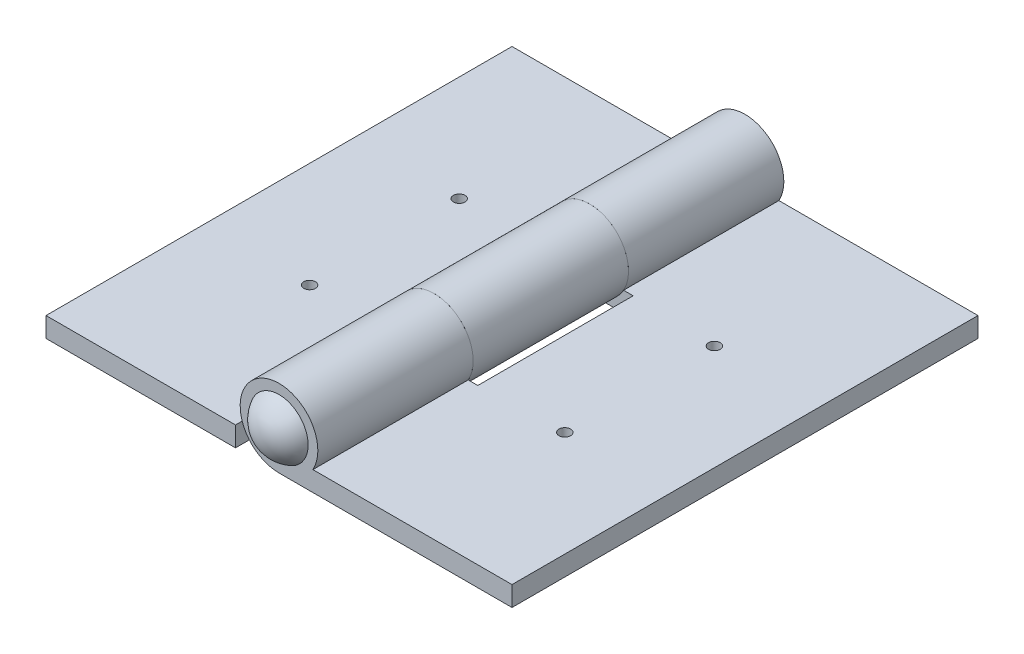
ISO-10303-21;
HEADER;
FILE_DESCRIPTION(('STEP AP214'),'2;1');
FILE_NAME('part.step','',(''),(''),'','','');
FILE_SCHEMA(('AUTOMOTIVE_DESIGN { 1 0 10303 214 1 1 1 1 }'));
ENDSEC;
DATA;
#1=APPLICATION_CONTEXT('core data for automotive mechanical design processes');
#2=APPLICATION_PROTOCOL_DEFINITION('international standard','automotive_design',2000,#1);
#3=PRODUCT_CONTEXT('',#1,'mechanical');
#4=PRODUCT('Part','Part','',(#3));
#5=PRODUCT_RELATED_PRODUCT_CATEGORY('part','',(#4));
#6=PRODUCT_DEFINITION_FORMATION('','',#4);
#7=PRODUCT_DEFINITION_CONTEXT('part definition',#1,'design');
#8=PRODUCT_DEFINITION('design','',#6,#7);
#9=PRODUCT_DEFINITION_SHAPE('','',#8);
#10=(LENGTH_UNIT() NAMED_UNIT(*) SI_UNIT(.MILLI.,.METRE.));
#11=(NAMED_UNIT(*) PLANE_ANGLE_UNIT() SI_UNIT($,.RADIAN.));
#12=(NAMED_UNIT(*) SI_UNIT($,.STERADIAN.) SOLID_ANGLE_UNIT());
#13=UNCERTAINTY_MEASURE_WITH_UNIT(LENGTH_MEASURE(1.E-05),#10,'distance_accuracy_value','');
#14=(GEOMETRIC_REPRESENTATION_CONTEXT(3) GLOBAL_UNCERTAINTY_ASSIGNED_CONTEXT((#13)) GLOBAL_UNIT_ASSIGNED_CONTEXT((#10,
#11,#12)) REPRESENTATION_CONTEXT('',''));
#15=CARTESIAN_POINT('',(0.,0.,0.));
#16=DIRECTION('',(0.,0.,1.));
#17=DIRECTION('',(1.,0.,0.));
#18=AXIS2_PLACEMENT_3D('',#15,#16,#17);
#19=CARTESIAN_POINT('',(0.,0.,-17.8436537890625));
#20=DIRECTION('',(0.,0.,-1.));
#21=DIRECTION('',(1.,0.,0.));
#22=AXIS2_PLACEMENT_3D('',#19,#20,#21);
#23=SPHERICAL_SURFACE('',#22,2.6693862109375);
#24=CARTESIAN_POINT('',(0.,0.,-19.05));
#25=DIRECTION('',(0.,0.,-1.));
#26=DIRECTION('',(-1.,0.,0.));
#27=AXIS2_PLACEMENT_3D('',#24,#25,#26);
#28=CIRCLE('',#27,2.38125);
#29=CARTESIAN_POINT('',(-2.38125,0.,-19.05));
#30=VERTEX_POINT('',#29);
#31=EDGE_CURVE('E59',#30,#30,#28,.T.);
#32=ORIENTED_EDGE('',*,*,#31,.T.);
#33=EDGE_LOOP('',(#32));
#34=FACE_BOUND('',#33,.T.);
#35=ADVANCED_FACE('F45',(#34),#23,.T.);
#36=CARTESIAN_POINT('',(0.,0.,17.8436537890625));
#37=DIRECTION('',(0.,0.,-1.));
#38=DIRECTION('',(-1.,0.,0.));
#39=AXIS2_PLACEMENT_3D('',#36,#37,#38);
#40=SPHERICAL_SURFACE('',#39,2.6693862109375);
#41=CARTESIAN_POINT('',(0.,0.,19.05));
#42=DIRECTION('',(0.,0.,-1.));
#43=DIRECTION('',(-1.,0.,0.));
#44=AXIS2_PLACEMENT_3D('',#41,#42,#43);
#45=CIRCLE('',#44,2.38125);
#46=CARTESIAN_POINT('',(-2.38125,0.,19.05));
#47=VERTEX_POINT('',#46);
#48=EDGE_CURVE('E11',#47,#47,#45,.T.);
#49=ORIENTED_EDGE('',*,*,#48,.F.);
#50=EDGE_LOOP('',(#49));
#51=FACE_BOUND('',#50,.T.);
#52=ADVANCED_FACE('F77',(#51),#40,.T.);
#53=CARTESIAN_POINT('',(-1.5875,0.,19.05));
#54=DIRECTION('',(0.,0.,-1.));
#55=DIRECTION('',(-1.,0.,0.));
#56=AXIS2_PLACEMENT_3D('',#53,#54,#55);
#57=PLANE('',#56);
#58=ORIENTED_EDGE('',*,*,#48,.T.);
#59=EDGE_LOOP('',(#58));
#60=FACE_BOUND('',#59,.T.);
#61=CARTESIAN_POINT('',(0.,0.,19.05));
#62=DIRECTION('',(0.,0.,-1.));
#63=DIRECTION('',(-1.,0.,0.));
#64=AXIS2_PLACEMENT_3D('',#61,#62,#63);
#65=CIRCLE('',#64,1.5875);
#66=CARTESIAN_POINT('',(-1.5875,0.,19.05));
#67=VERTEX_POINT('',#66);
#68=EDGE_CURVE('E51',#67,#67,#65,.T.);
#69=ORIENTED_EDGE('',*,*,#68,.F.);
#70=EDGE_LOOP('',(#69));
#71=FACE_BOUND('',#70,.T.);
#72=ADVANCED_FACE('F74',(#60,#71),#57,.T.);
#73=CARTESIAN_POINT('',(0.,0.,-20.51304));
#74=DIRECTION('',(0.,0.,-1.));
#75=DIRECTION('',(-1.,0.,0.));
#76=AXIS2_PLACEMENT_3D('',#73,#74,#75);
#77=CYLINDRICAL_SURFACE('',#76,1.5875);
#78=ORIENTED_EDGE('',*,*,#68,.T.);
#79=EDGE_LOOP('',(#78));
#80=FACE_BOUND('',#79,.T.);
#81=CARTESIAN_POINT('',(0.,0.,-19.05));
#82=DIRECTION('',(0.,0.,-1.));
#83=DIRECTION('',(-1.,0.,0.));
#84=AXIS2_PLACEMENT_3D('',#81,#82,#83);
#85=CIRCLE('',#84,1.5875);
#86=CARTESIAN_POINT('',(-1.5875,0.,-19.05));
#87=VERTEX_POINT('',#86);
#88=EDGE_CURVE('E55',#87,#87,#85,.T.);
#89=ORIENTED_EDGE('',*,*,#88,.F.);
#90=EDGE_LOOP('',(#89));
#91=FACE_BOUND('',#90,.T.);
#92=ADVANCED_FACE('F68',(#80,#91),#77,.T.);
#93=CARTESIAN_POINT('',(-2.38125,0.,-19.05));
#94=DIRECTION('',(0.,0.,1.));
#95=DIRECTION('',(1.,0.,0.));
#96=AXIS2_PLACEMENT_3D('',#93,#94,#95);
#97=PLANE('',#96);
#98=ORIENTED_EDGE('',*,*,#88,.T.);
#99=EDGE_LOOP('',(#98));
#100=FACE_BOUND('',#99,.T.);
#101=ORIENTED_EDGE('',*,*,#31,.F.);
#102=EDGE_LOOP('',(#101));
#103=FACE_BOUND('',#102,.T.);
#104=ADVANCED_FACE('F66',(#100,#103),#97,.T.);
#105=CLOSED_SHELL('',(#35,#52,#72,#92,#104));
#106=MANIFOLD_SOLID_BREP('B2',#105);
#107=CARTESIAN_POINT('',(-3.556,-1.54940000000001,19.05));
#108=DIRECTION('',(-1.,0.,0.));
#109=DIRECTION('',(0.,-1.,0.));
#110=AXIS2_PLACEMENT_3D('',#107,#108,#109);
#111=PLANE('',#110);
#112=DIRECTION('',(0.,-1.,0.));
#113=VECTOR('',#112,1.);
#114=CARTESIAN_POINT('',(-3.556,-1.54940000000001,6.35));
#115=LINE('',#114,#113);
#116=CARTESIAN_POINT('',(-3.556,-1.54940000000001,6.35));
#117=VERTEX_POINT('',#116);
#118=CARTESIAN_POINT('',(-3.556,-3.17500000000001,6.35));
#119=VERTEX_POINT('',#118);
#120=EDGE_CURVE('E220',#117,#119,#115,.T.);
#121=ORIENTED_EDGE('',*,*,#120,.F.);
#122=DIRECTION('',(0.,0.,-1.));
#123=VECTOR('',#122,1.);
#124=CARTESIAN_POINT('',(-3.556,-1.54940000000001,19.05));
#125=LINE('',#124,#123);
#126=CARTESIAN_POINT('',(-3.556,-1.54940000000001,19.05));
#127=VERTEX_POINT('',#126);
#128=EDGE_CURVE('E261',#127,#117,#125,.T.);
#129=ORIENTED_EDGE('',*,*,#128,.F.);
#130=DIRECTION('',(0.,1.,0.));
#131=VECTOR('',#130,1.);
#132=CARTESIAN_POINT('',(-3.556,-1.54940000000001,19.05));
#133=LINE('',#132,#131);
#134=CARTESIAN_POINT('',(-3.556,-3.17500000000001,19.05));
#135=VERTEX_POINT('',#134);
#136=EDGE_CURVE('E280',#135,#127,#133,.T.);
#137=ORIENTED_EDGE('',*,*,#136,.F.);
#138=DIRECTION('',(0.,0.,-1.));
#139=VECTOR('',#138,1.);
#140=CARTESIAN_POINT('',(-3.556,-3.17500000000001,19.05));
#141=LINE('',#140,#139);
#142=EDGE_CURVE('E133',#135,#119,#141,.T.);
#143=ORIENTED_EDGE('',*,*,#142,.T.);
#144=EDGE_LOOP('',(#121,#129,#137,#143));
#145=FACE_BOUND('',#144,.T.);
#146=ADVANCED_FACE('F124',(#145),#111,.F.);
#147=CARTESIAN_POINT('',(-19.05,-1.54940000000001,19.05));
#148=DIRECTION('',(1.,0.,0.));
#149=DIRECTION('',(0.,0.,-1.));
#150=AXIS2_PLACEMENT_3D('',#147,#148,#149);
#151=PLANE('',#150);
#152=DIRECTION('',(0.,-1.,0.));
#153=VECTOR('',#152,1.);
#154=CARTESIAN_POINT('',(-19.05,-1.54940000000001,-19.05));
#155=LINE('',#154,#153);
#156=CARTESIAN_POINT('',(-19.05,-1.54940000000001,-19.05));
#157=VERTEX_POINT('',#156);
#158=CARTESIAN_POINT('',(-19.05,-3.17500000000001,-19.05));
#159=VERTEX_POINT('',#158);
#160=EDGE_CURVE('E287',#157,#159,#155,.T.);
#161=ORIENTED_EDGE('',*,*,#160,.T.);
#162=DIRECTION('',(0.,0.,-1.));
#163=VECTOR('',#162,1.);
#164=CARTESIAN_POINT('',(-19.05,-3.17500000000001,19.05));
#165=LINE('',#164,#163);
#166=CARTESIAN_POINT('',(-19.05,-3.17500000000001,19.05));
#167=VERTEX_POINT('',#166);
#168=EDGE_CURVE('E43',#167,#159,#165,.T.);
#169=ORIENTED_EDGE('',*,*,#168,.F.);
#170=DIRECTION('',(0.,-1.,0.));
#171=VECTOR('',#170,1.);
#172=CARTESIAN_POINT('',(-19.05,-1.54940000000001,19.05));
#173=LINE('',#172,#171);
#174=CARTESIAN_POINT('',(-19.05,-1.54940000000001,19.05));
#175=VERTEX_POINT('',#174);
#176=EDGE_CURVE('E283',#175,#167,#173,.T.);
#177=ORIENTED_EDGE('',*,*,#176,.F.);
#178=DIRECTION('',(0.,0.,-1.));
#179=VECTOR('',#178,1.);
#180=CARTESIAN_POINT('',(-19.05,-1.54940000000001,19.05));
#181=LINE('',#180,#179);
#182=EDGE_CURVE('E262',#175,#157,#181,.T.);
#183=ORIENTED_EDGE('',*,*,#182,.T.);
#184=EDGE_LOOP('',(#161,#169,#177,#183));
#185=FACE_BOUND('',#184,.T.);
#186=ADVANCED_FACE('F126',(#185),#151,.F.);
#187=CARTESIAN_POINT('',(-19.05,-3.17500000000001,19.05));
#188=DIRECTION('',(0.,1.,0.));
#189=DIRECTION('',(0.,0.,1.));
#190=AXIS2_PLACEMENT_3D('',#187,#188,#189);
#191=PLANE('',#190);
#192=CARTESIAN_POINT('',(-10.43,-3.17500000000001,-6.115));
#193=DIRECTION('',(0.,-1.,0.));
#194=DIRECTION('',(0.,0.,-1.));
#195=AXIS2_PLACEMENT_3D('',#192,#193,#194);
#196=CIRCLE('',#195,0.474999999999988);
#197=CARTESIAN_POINT('',(-10.43,-3.17500000000001,-6.58999999999998));
#198=VERTEX_POINT('',#197);
#199=EDGE_CURVE('E327',#198,#198,#196,.T.);
#200=ORIENTED_EDGE('',*,*,#199,.F.);
#201=EDGE_LOOP('',(#200));
#202=FACE_BOUND('',#201,.T.);
#203=CARTESIAN_POINT('',(-10.43,-3.17500000000001,6.115));
#204=DIRECTION('',(0.,-1.,0.));
#205=DIRECTION('',(0.,0.,-1.));
#206=AXIS2_PLACEMENT_3D('',#203,#204,#205);
#207=CIRCLE('',#206,0.474999999999988);
#208=CARTESIAN_POINT('',(-10.43,-3.17500000000001,5.64000000000002));
#209=VERTEX_POINT('',#208);
#210=EDGE_CURVE('E330',#209,#209,#207,.T.);
#211=ORIENTED_EDGE('',*,*,#210,.F.);
#212=EDGE_LOOP('',(#211));
#213=FACE_BOUND('',#212,.T.);
#214=DIRECTION('',(1.,0.,0.));
#215=VECTOR('',#214,1.);
#216=CARTESIAN_POINT('',(-19.05,-3.17500000000001,-19.05));
#217=LINE('',#216,#215);
#218=CARTESIAN_POINT('',(-3.556,-3.17500000000001,-19.05));
#219=VERTEX_POINT('',#218);
#220=EDGE_CURVE('E290',#159,#219,#217,.T.);
#221=ORIENTED_EDGE('',*,*,#220,.T.);
#222=CARTESIAN_POINT('',(-3.556,-3.17500000000001,-6.34999999999998));
#223=VERTEX_POINT('',#222);
#224=EDGE_CURVE('E265',#223,#219,#141,.T.);
#225=ORIENTED_EDGE('',*,*,#224,.F.);
#226=DIRECTION('',(1.,0.,0.));
#227=VECTOR('',#226,1.);
#228=CARTESIAN_POINT('',(-3.556,-3.17500000000001,-6.35));
#229=LINE('',#228,#227);
#230=CARTESIAN_POINT('',(0.,-3.17500000000001,-6.35));
#231=VERTEX_POINT('',#230);
#232=EDGE_CURVE('E141',#223,#231,#229,.T.);
#233=ORIENTED_EDGE('',*,*,#232,.T.);
#234=DIRECTION('',(0.,0.,-1.));
#235=VECTOR('',#234,1.);
#236=CARTESIAN_POINT('',(0.,-3.17500000000001,15.603586385829));
#237=LINE('',#236,#235);
#238=CARTESIAN_POINT('',(0.,-3.17500000000001,6.35));
#239=VERTEX_POINT('',#238);
#240=EDGE_CURVE('E198',#239,#231,#237,.T.);
#241=ORIENTED_EDGE('',*,*,#240,.F.);
#242=DIRECTION('',(1.,0.,0.));
#243=VECTOR('',#242,1.);
#244=CARTESIAN_POINT('',(-3.556,-3.17500000000001,6.35));
#245=LINE('',#244,#243);
#246=EDGE_CURVE('E203',#119,#239,#245,.T.);
#247=ORIENTED_EDGE('',*,*,#246,.F.);
#248=ORIENTED_EDGE('',*,*,#142,.F.);
#249=DIRECTION('',(1.,0.,0.));
#250=VECTOR('',#249,1.);
#251=CARTESIAN_POINT('',(-19.05,-3.17500000000001,19.05));
#252=LINE('',#251,#250);
#253=EDGE_CURVE('E177',#167,#135,#252,.T.);
#254=ORIENTED_EDGE('',*,*,#253,.F.);
#255=ORIENTED_EDGE('',*,*,#168,.T.);
#256=EDGE_LOOP('',(#221,#225,#233,#241,#247,#248,#254,#255));
#257=FACE_BOUND('',#256,.T.);
#258=ADVANCED_FACE('F201',(#202,#213,#257),#191,.F.);
#259=CARTESIAN_POINT('',(-3.556,-1.54940000000001,-6.35));
#260=VERTEX_POINT('',#259);
#261=CARTESIAN_POINT('',(-3.556,-1.54940000000001,-19.05));
#262=VERTEX_POINT('',#261);
#263=EDGE_CURVE('E253',#260,#262,#125,.T.);
#264=ORIENTED_EDGE('',*,*,#263,.F.);
#265=DIRECTION('',(0.,-1.,0.));
#266=VECTOR('',#265,1.);
#267=CARTESIAN_POINT('',(-3.556,-1.54940000000001,-6.35));
#268=LINE('',#267,#266);
#269=EDGE_CURVE('E246',#260,#223,#268,.T.);
#270=ORIENTED_EDGE('',*,*,#269,.T.);
#271=ORIENTED_EDGE('',*,*,#224,.T.);
#272=DIRECTION('',(0.,1.,0.));
#273=VECTOR('',#272,1.);
#274=CARTESIAN_POINT('',(-3.556,-1.54940000000001,-19.05));
#275=LINE('',#274,#273);
#276=EDGE_CURVE('E260',#219,#262,#275,.T.);
#277=ORIENTED_EDGE('',*,*,#276,.T.);
#278=EDGE_LOOP('',(#264,#270,#271,#277));
#279=FACE_BOUND('',#278,.T.);
#280=ADVANCED_FACE('F258',(#279),#111,.F.);
#281=CARTESIAN_POINT('',(-19.05,-1.54940000000001,19.05));
#282=DIRECTION('',(0.,-1.,0.));
#283=DIRECTION('',(0.,0.,-1.));
#284=AXIS2_PLACEMENT_3D('',#281,#282,#283);
#285=PLANE('',#284);
#286=CARTESIAN_POINT('',(-10.43,-1.54940000000001,-6.115));
#287=DIRECTION('',(0.,-1.,0.));
#288=DIRECTION('',(0.,0.,-1.));
#289=AXIS2_PLACEMENT_3D('',#286,#287,#288);
#290=CIRCLE('',#289,0.474999999999994);
#291=CARTESIAN_POINT('',(-10.43,-1.54940000000001,-6.58999999999999));
#292=VERTEX_POINT('',#291);
#293=EDGE_CURVE('E332',#292,#292,#290,.T.);
#294=ORIENTED_EDGE('',*,*,#293,.T.);
#295=EDGE_LOOP('',(#294));
#296=FACE_BOUND('',#295,.T.);
#297=CARTESIAN_POINT('',(-10.43,-1.54940000000001,6.115));
#298=DIRECTION('',(0.,-1.,0.));
#299=DIRECTION('',(0.,0.,-1.));
#300=AXIS2_PLACEMENT_3D('',#297,#298,#299);
#301=CIRCLE('',#300,0.474999999999994);
#302=CARTESIAN_POINT('',(-10.43,-1.54940000000001,5.64000000000001));
#303=VERTEX_POINT('',#302);
#304=EDGE_CURVE('E225',#303,#303,#301,.T.);
#305=ORIENTED_EDGE('',*,*,#304,.T.);
#306=EDGE_LOOP('',(#305));
#307=FACE_BOUND('',#306,.T.);
#308=DIRECTION('',(-1.,0.,0.));
#309=VECTOR('',#308,1.);
#310=CARTESIAN_POINT('',(-19.05,-1.54940000000001,-19.05));
#311=LINE('',#310,#309);
#312=EDGE_CURVE('E170',#262,#157,#311,.T.);
#313=ORIENTED_EDGE('',*,*,#312,.T.);
#314=ORIENTED_EDGE('',*,*,#182,.F.);
#315=DIRECTION('',(-1.,0.,0.));
#316=VECTOR('',#315,1.);
#317=CARTESIAN_POINT('',(-19.05,-1.54940000000001,19.05));
#318=LINE('',#317,#316);
#319=EDGE_CURVE('E150',#127,#175,#318,.T.);
#320=ORIENTED_EDGE('',*,*,#319,.F.);
#321=ORIENTED_EDGE('',*,*,#128,.T.);
#322=DIRECTION('',(-1.,0.,0.));
#323=VECTOR('',#322,1.);
#324=CARTESIAN_POINT('',(-2.77127852082752,-1.5494,6.35));
#325=LINE('',#324,#323);
#326=CARTESIAN_POINT('',(-2.77127852082752,-1.5494,6.35));
#327=VERTEX_POINT('',#326);
#328=EDGE_CURVE('E216',#327,#117,#325,.T.);
#329=ORIENTED_EDGE('',*,*,#328,.F.);
#330=DIRECTION('',(0.,0.,-1.));
#331=VECTOR('',#330,1.);
#332=CARTESIAN_POINT('',(-2.77127852082752,-1.5494,15.603586385829));
#333=LINE('',#332,#331);
#334=CARTESIAN_POINT('',(-2.77127852082752,-1.5494,-6.35));
#335=VERTEX_POINT('',#334);
#336=EDGE_CURVE('E208',#327,#335,#333,.T.);
#337=ORIENTED_EDGE('',*,*,#336,.T.);
#338=DIRECTION('',(-1.,0.,0.));
#339=VECTOR('',#338,1.);
#340=CARTESIAN_POINT('',(-2.77127852082752,-1.5494,-6.35));
#341=LINE('',#340,#339);
#342=EDGE_CURVE('E242',#335,#260,#341,.T.);
#343=ORIENTED_EDGE('',*,*,#342,.T.);
#344=ORIENTED_EDGE('',*,*,#263,.T.);
#345=EDGE_LOOP('',(#313,#314,#320,#321,#329,#337,#343,#344));
#346=FACE_BOUND('',#345,.T.);
#347=ADVANCED_FACE('F251',(#296,#307,#346),#285,.F.);
#348=CARTESIAN_POINT('',(-19.05,-3.17500000000001,19.05));
#349=DIRECTION('',(0.,0.,1.));
#350=DIRECTION('',(1.,0.,0.));
#351=AXIS2_PLACEMENT_3D('',#348,#349,#350);
#352=PLANE('',#351);
#353=ORIENTED_EDGE('',*,*,#176,.T.);
#354=ORIENTED_EDGE('',*,*,#253,.T.);
#355=ORIENTED_EDGE('',*,*,#136,.T.);
#356=ORIENTED_EDGE('',*,*,#319,.T.);
#357=EDGE_LOOP('',(#353,#354,#355,#356));
#358=FACE_BOUND('',#357,.T.);
#359=ADVANCED_FACE('F294',(#358),#352,.T.);
#360=CARTESIAN_POINT('',(-19.05,-3.17500000000001,-19.05));
#361=DIRECTION('',(0.,0.,1.));
#362=DIRECTION('',(1.,0.,0.));
#363=AXIS2_PLACEMENT_3D('',#360,#361,#362);
#364=PLANE('',#363);
#365=ORIENTED_EDGE('',*,*,#160,.F.);
#366=ORIENTED_EDGE('',*,*,#312,.F.);
#367=ORIENTED_EDGE('',*,*,#276,.F.);
#368=ORIENTED_EDGE('',*,*,#220,.F.);
#369=EDGE_LOOP('',(#365,#366,#367,#368));
#370=FACE_BOUND('',#369,.T.);
#371=ADVANCED_FACE('F298',(#370),#364,.F.);
#372=CARTESIAN_POINT('',(0.,0.,15.603586385829));
#373=DIRECTION('',(0.,0.,-1.));
#374=DIRECTION('',(-1.,0.,0.));
#375=AXIS2_PLACEMENT_3D('',#372,#373,#374);
#376=CYLINDRICAL_SURFACE('',#375,3.175);
#377=CARTESIAN_POINT('',(0.,0.,6.35));
#378=DIRECTION('',(0.,0.,1.));
#379=DIRECTION('',(1.,0.,0.));
#380=AXIS2_PLACEMENT_3D('',#377,#378,#379);
#381=CIRCLE('',#380,3.175);
#382=EDGE_CURVE('E212',#239,#327,#381,.T.);
#383=ORIENTED_EDGE('',*,*,#382,.F.);
#384=ORIENTED_EDGE('',*,*,#240,.T.);
#385=CARTESIAN_POINT('',(0.,0.,-6.35));
#386=DIRECTION('',(0.,0.,1.));
#387=DIRECTION('',(1.,0.,0.));
#388=AXIS2_PLACEMENT_3D('',#385,#386,#387);
#389=CIRCLE('',#388,3.175);
#390=EDGE_CURVE('E240',#231,#335,#389,.T.);
#391=ORIENTED_EDGE('',*,*,#390,.T.);
#392=ORIENTED_EDGE('',*,*,#336,.F.);
#393=EDGE_LOOP('',(#383,#384,#391,#392));
#394=FACE_BOUND('',#393,.T.);
#395=ADVANCED_FACE('F213',(#394),#376,.T.);
#396=CARTESIAN_POINT('',(0.,0.,-6.35));
#397=DIRECTION('',(0.,0.,1.));
#398=DIRECTION('',(1.,0.,0.));
#399=AXIS2_PLACEMENT_3D('',#396,#397,#398);
#400=PLANE('',#399);
#401=ORIENTED_EDGE('',*,*,#390,.F.);
#402=ORIENTED_EDGE('',*,*,#232,.F.);
#403=ORIENTED_EDGE('',*,*,#269,.F.);
#404=ORIENTED_EDGE('',*,*,#342,.F.);
#405=EDGE_LOOP('',(#401,#402,#403,#404));
#406=FACE_BOUND('',#405,.T.);
#407=CARTESIAN_POINT('',(0.,0.,-6.35));
#408=DIRECTION('',(0.,0.,1.));
#409=DIRECTION('',(1.,0.,0.));
#410=AXIS2_PLACEMENT_3D('',#407,#408,#409);
#411=CIRCLE('',#410,1.5875);
#412=CARTESIAN_POINT('',(1.5875,0.,-6.35));
#413=VERTEX_POINT('',#412);
#414=EDGE_CURVE('E215',#413,#413,#411,.T.);
#415=ORIENTED_EDGE('',*,*,#414,.T.);
#416=EDGE_LOOP('',(#415));
#417=FACE_BOUND('',#416,.T.);
#418=ADVANCED_FACE('F255',(#406,#417),#400,.F.);
#419=CARTESIAN_POINT('',(0.,0.,15.603586385829));
#420=DIRECTION('',(0.,0.,-1.));
#421=DIRECTION('',(-1.,0.,0.));
#422=AXIS2_PLACEMENT_3D('',#419,#420,#421);
#423=CYLINDRICAL_SURFACE('',#422,1.5875);
#424=ORIENTED_EDGE('',*,*,#414,.F.);
#425=EDGE_LOOP('',(#424));
#426=FACE_BOUND('',#425,.T.);
#427=CARTESIAN_POINT('',(0.,0.,6.35));
#428=DIRECTION('',(0.,0.,1.));
#429=DIRECTION('',(1.,0.,0.));
#430=AXIS2_PLACEMENT_3D('',#427,#428,#429);
#431=CIRCLE('',#430,1.5875);
#432=CARTESIAN_POINT('',(1.5875,0.,6.35));
#433=VERTEX_POINT('',#432);
#434=EDGE_CURVE('E222',#433,#433,#431,.T.);
#435=ORIENTED_EDGE('',*,*,#434,.T.);
#436=EDGE_LOOP('',(#435));
#437=FACE_BOUND('',#436,.T.);
#438=ADVANCED_FACE('F352',(#426,#437),#423,.F.);
#439=CARTESIAN_POINT('',(-3.55599999999999,-3.17500000000001,6.35));
#440=DIRECTION('',(0.,0.,1.));
#441=DIRECTION('',(1.,0.,0.));
#442=AXIS2_PLACEMENT_3D('',#439,#440,#441);
#443=PLANE('',#442);
#444=ORIENTED_EDGE('',*,*,#434,.F.);
#445=EDGE_LOOP('',(#444));
#446=FACE_BOUND('',#445,.T.);
#447=ORIENTED_EDGE('',*,*,#246,.T.);
#448=ORIENTED_EDGE('',*,*,#382,.T.);
#449=ORIENTED_EDGE('',*,*,#328,.T.);
#450=ORIENTED_EDGE('',*,*,#120,.T.);
#451=EDGE_LOOP('',(#447,#448,#449,#450));
#452=FACE_BOUND('',#451,.T.);
#453=ADVANCED_FACE('F218',(#446,#452),#443,.T.);
#454=CARTESIAN_POINT('',(-10.43,-3.17500000000001,6.115));
#455=DIRECTION('',(0.,-1.,0.));
#456=DIRECTION('',(0.,0.,-1.));
#457=AXIS2_PLACEMENT_3D('',#454,#455,#456);
#458=CYLINDRICAL_SURFACE('',#457,0.474999999999994);
#459=ORIENTED_EDGE('',*,*,#304,.F.);
#460=EDGE_LOOP('',(#459));
#461=FACE_BOUND('',#460,.T.);
#462=ORIENTED_EDGE('',*,*,#210,.T.);
#463=EDGE_LOOP('',(#462));
#464=FACE_BOUND('',#463,.T.);
#465=ADVANCED_FACE('F340',(#461,#464),#458,.F.);
#466=CARTESIAN_POINT('',(-10.43,-3.17500000000001,-6.115));
#467=DIRECTION('',(0.,-1.,0.));
#468=DIRECTION('',(0.,0.,-1.));
#469=AXIS2_PLACEMENT_3D('',#466,#467,#468);
#470=CYLINDRICAL_SURFACE('',#469,0.474999999999994);
#471=ORIENTED_EDGE('',*,*,#293,.F.);
#472=EDGE_LOOP('',(#471));
#473=FACE_BOUND('',#472,.T.);
#474=ORIENTED_EDGE('',*,*,#199,.T.);
#475=EDGE_LOOP('',(#474));
#476=FACE_BOUND('',#475,.T.);
#477=ADVANCED_FACE('F338',(#473,#476),#470,.F.);
#478=CLOSED_SHELL('',(#146,#186,#258,#280,#347,#359,#371,#395,#418,#438,#453,#465,#477));
#479=MANIFOLD_SOLID_BREP('B6',#478);
#480=CARTESIAN_POINT('',(19.05,-3.175,19.05));
#481=DIRECTION('',(0.,1.,0.));
#482=DIRECTION('',(-1.,0.,0.));
#483=AXIS2_PLACEMENT_3D('',#480,#481,#482);
#484=PLANE('',#483);
#485=CARTESIAN_POINT('',(10.43,-3.175,-6.115));
#486=DIRECTION('',(0.,-1.,0.));
#487=DIRECTION('',(0.,0.,-1.));
#488=AXIS2_PLACEMENT_3D('',#485,#486,#487);
#489=CIRCLE('',#488,0.474999999999988);
#490=CARTESIAN_POINT('',(10.43,-3.175,-6.58999999999998));
#491=VERTEX_POINT('',#490);
#492=EDGE_CURVE('E674',#491,#491,#489,.T.);
#493=ORIENTED_EDGE('',*,*,#492,.F.);
#494=EDGE_LOOP('',(#493));
#495=FACE_BOUND('',#494,.T.);
#496=DIRECTION('',(0.,0.,-1.));
#497=VECTOR('',#496,1.);
#498=CARTESIAN_POINT('',(3.55599999999999,-3.17500000000001,-6.35));
#499=LINE('',#498,#497);
#500=CARTESIAN_POINT('',(3.55599999999999,-3.175,6.35));
#501=VERTEX_POINT('',#500);
#502=CARTESIAN_POINT('',(3.55599999999999,-3.17500000000001,-6.35));
#503=VERTEX_POINT('',#502);
#504=EDGE_CURVE('E470',#501,#503,#499,.T.);
#505=ORIENTED_EDGE('',*,*,#504,.T.);
#506=DIRECTION('',(-1.,0.,0.));
#507=VECTOR('',#506,1.);
#508=CARTESIAN_POINT('',(-3.55599999999999,-3.17500000000001,-6.35));
#509=LINE('',#508,#507);
#510=CARTESIAN_POINT('',(0.,-3.17500000000001,-6.35));
#511=VERTEX_POINT('',#510);
#512=EDGE_CURVE('E538',#503,#511,#509,.T.);
#513=ORIENTED_EDGE('',*,*,#512,.T.);
#514=DIRECTION('',(0.,0.,-1.));
#515=VECTOR('',#514,1.);
#516=CARTESIAN_POINT('',(0.,-3.175,19.05));
#517=LINE('',#516,#515);
#518=CARTESIAN_POINT('',(0.,-3.175,-19.05));
#519=VERTEX_POINT('',#518);
#520=EDGE_CURVE('E588',#511,#519,#517,.T.);
#521=ORIENTED_EDGE('',*,*,#520,.T.);
#522=DIRECTION('',(1.,0.,0.));
#523=VECTOR('',#522,1.);
#524=CARTESIAN_POINT('',(19.05,-3.175,-19.05));
#525=LINE('',#524,#523);
#526=CARTESIAN_POINT('',(19.05,-3.175,-19.05));
#527=VERTEX_POINT('',#526);
#528=EDGE_CURVE('E499',#519,#527,#525,.T.);
#529=ORIENTED_EDGE('',*,*,#528,.T.);
#530=DIRECTION('',(0.,0.,-1.));
#531=VECTOR('',#530,1.);
#532=CARTESIAN_POINT('',(19.05,-3.175,19.05));
#533=LINE('',#532,#531);
#534=CARTESIAN_POINT('',(19.05,-3.175,19.05));
#535=VERTEX_POINT('',#534);
#536=EDGE_CURVE('E577',#535,#527,#533,.T.);
#537=ORIENTED_EDGE('',*,*,#536,.F.);
#538=DIRECTION('',(1.,0.,0.));
#539=VECTOR('',#538,1.);
#540=CARTESIAN_POINT('',(19.05,-3.175,19.05));
#541=LINE('',#540,#539);
#542=CARTESIAN_POINT('',(0.,-3.175,19.05));
#543=VERTEX_POINT('',#542);
#544=EDGE_CURVE('E479',#543,#535,#541,.T.);
#545=ORIENTED_EDGE('',*,*,#544,.F.);
#546=CARTESIAN_POINT('',(0.,-3.17500000000001,6.35));
#547=VERTEX_POINT('',#546);
#548=EDGE_CURVE('E589',#543,#547,#517,.T.);
#549=ORIENTED_EDGE('',*,*,#548,.T.);
#550=DIRECTION('',(1.,0.,0.));
#551=VECTOR('',#550,1.);
#552=CARTESIAN_POINT('',(-3.55599999999999,-3.17500000000001,6.35));
#553=LINE('',#552,#551);
#554=EDGE_CURVE('E548',#547,#501,#553,.T.);
#555=ORIENTED_EDGE('',*,*,#554,.T.);
#556=EDGE_LOOP('',(#505,#513,#521,#529,#537,#545,#549,#555));
#557=FACE_BOUND('',#556,.T.);
#558=CARTESIAN_POINT('',(10.43,-3.17500000000001,6.115));
#559=DIRECTION('',(0.,-1.,0.));
#560=DIRECTION('',(0.,0.,-1.));
#561=AXIS2_PLACEMENT_3D('',#558,#559,#560);
#562=CIRCLE('',#561,0.474999999999988);
#563=CARTESIAN_POINT('',(10.43,-3.17500000000001,5.64000000000001));
#564=VERTEX_POINT('',#563);
#565=EDGE_CURVE('E676',#564,#564,#562,.T.);
#566=ORIENTED_EDGE('',*,*,#565,.F.);
#567=EDGE_LOOP('',(#566));
#568=FACE_BOUND('',#567,.T.);
#569=ADVANCED_FACE('F453',(#495,#557,#568),#484,.F.);
#570=CARTESIAN_POINT('',(0.,0.,19.05));
#571=DIRECTION('',(0.,0.,-1.));
#572=DIRECTION('',(-1.,0.,0.));
#573=AXIS2_PLACEMENT_3D('',#570,#571,#572);
#574=CYLINDRICAL_SURFACE('',#573,3.175);
#575=CARTESIAN_POINT('',(0.,0.,6.35));
#576=DIRECTION('',(0.,0.,1.));
#577=DIRECTION('',(1.,0.,0.));
#578=AXIS2_PLACEMENT_3D('',#575,#576,#577);
#579=CIRCLE('',#578,3.175);
#580=CARTESIAN_POINT('',(2.77127852082752,-1.5494,6.35));
#581=VERTEX_POINT('',#580);
#582=EDGE_CURVE('E555',#581,#547,#579,.T.);
#583=ORIENTED_EDGE('',*,*,#582,.T.);
#584=ORIENTED_EDGE('',*,*,#548,.F.);
#585=CARTESIAN_POINT('',(0.,0.,19.05));
#586=DIRECTION('',(0.,0.,1.));
#587=DIRECTION('',(-1.,0.,0.));
#588=AXIS2_PLACEMENT_3D('',#585,#586,#587);
#589=CIRCLE('',#588,3.175);
#590=CARTESIAN_POINT('',(2.77127852082752,-1.5494,19.05));
#591=VERTEX_POINT('',#590);
#592=EDGE_CURVE('E574',#591,#543,#589,.T.);
#593=ORIENTED_EDGE('',*,*,#592,.F.);
#594=DIRECTION('',(0.,0.,-1.));
#595=VECTOR('',#594,1.);
#596=CARTESIAN_POINT('',(2.77127852082752,-1.5494,19.05));
#597=LINE('',#596,#595);
#598=EDGE_CURVE('E462',#591,#581,#597,.T.);
#599=ORIENTED_EDGE('',*,*,#598,.T.);
#600=EDGE_LOOP('',(#583,#584,#593,#599));
#601=FACE_BOUND('',#600,.T.);
#602=ADVANCED_FACE('F617',(#601),#574,.T.);
#603=CARTESIAN_POINT('',(0.,0.,19.05));
#604=DIRECTION('',(0.,0.,-1.));
#605=DIRECTION('',(-1.,0.,0.));
#606=AXIS2_PLACEMENT_3D('',#603,#604,#605);
#607=CYLINDRICAL_SURFACE('',#606,1.5875);
#608=CARTESIAN_POINT('',(0.,0.,-6.35));
#609=DIRECTION('',(0.,0.,-1.));
#610=DIRECTION('',(-1.,0.,0.));
#611=AXIS2_PLACEMENT_3D('',#608,#609,#610);
#612=CIRCLE('',#611,1.5875);
#613=CARTESIAN_POINT('',(-1.5875,0.,-6.34999999999999));
#614=VERTEX_POINT('',#613);
#615=EDGE_CURVE('E457',#614,#614,#612,.T.);
#616=CARTESIAN_POINT('',(0.,0.,-19.05));
#617=DIRECTION('',(0.,0.,1.));
#618=DIRECTION('',(1.,0.,0.));
#619=AXIS2_PLACEMENT_3D('',#616,#617,#618);
#620=CIRCLE('',#619,1.5875);
#621=CARTESIAN_POINT('',(-1.5875,0.,-19.05));
#622=VERTEX_POINT('',#621);
#623=EDGE_CURVE('E564',#622,#622,#620,.T.);
#624=CARTESIAN_POINT('',(-1.5875,0.,-6.34999999999999));
#625=CARTESIAN_POINT('',(-1.5875,0.,-6.48229166666666));
#626=CARTESIAN_POINT('',(-1.5875,0.,-6.61458333333333));
#627=CARTESIAN_POINT('',(-1.5875,0.,-6.87916666666666));
#628=CARTESIAN_POINT('',(-1.5875,0.,-7.01145833333333));
#629=CARTESIAN_POINT('',(-1.5875,0.,-7.27604166666666));
#630=CARTESIAN_POINT('',(-1.5875,0.,-7.40833333333333));
#631=CARTESIAN_POINT('',(-1.5875,0.,-7.67291666666666));
#632=CARTESIAN_POINT('',(-1.5875,0.,-7.80520833333333));
#633=CARTESIAN_POINT('',(-1.5875,0.,-8.06979166666666));
#634=CARTESIAN_POINT('',(-1.5875,0.,-8.20208333333333));
#635=CARTESIAN_POINT('',(-1.5875,0.,-8.46666666666666));
#636=CARTESIAN_POINT('',(-1.5875,0.,-8.59895833333333));
#637=CARTESIAN_POINT('',(-1.5875,0.,-8.86354166666666));
#638=CARTESIAN_POINT('',(-1.5875,0.,-8.99583333333333));
#639=CARTESIAN_POINT('',(-1.5875,0.,-9.26041666666666));
#640=CARTESIAN_POINT('',(-1.5875,0.,-9.39270833333333));
#641=CARTESIAN_POINT('',(-1.5875,0.,-9.65729166666666));
#642=CARTESIAN_POINT('',(-1.5875,0.,-9.78958333333333));
#643=CARTESIAN_POINT('',(-1.5875,0.,-10.0541666666667));
#644=CARTESIAN_POINT('',(-1.5875,0.,-10.1864583333333));
#645=CARTESIAN_POINT('',(-1.5875,0.,-10.4510416666667));
#646=CARTESIAN_POINT('',(-1.5875,0.,-10.5833333333333));
#647=CARTESIAN_POINT('',(-1.5875,0.,-10.8479166666667));
#648=CARTESIAN_POINT('',(-1.5875,0.,-10.9802083333333));
#649=CARTESIAN_POINT('',(-1.5875,0.,-11.2447916666667));
#650=CARTESIAN_POINT('',(-1.5875,0.,-11.3770833333333));
#651=CARTESIAN_POINT('',(-1.5875,0.,-11.6416666666667));
#652=CARTESIAN_POINT('',(-1.5875,0.,-11.7739583333333));
#653=CARTESIAN_POINT('',(-1.5875,0.,-12.0385416666667));
#654=CARTESIAN_POINT('',(-1.5875,0.,-12.1708333333333));
#655=CARTESIAN_POINT('',(-1.5875,0.,-12.4354166666667));
#656=CARTESIAN_POINT('',(-1.5875,0.,-12.5677083333333));
#657=CARTESIAN_POINT('',(-1.5875,0.,-12.8322916666667));
#658=CARTESIAN_POINT('',(-1.5875,0.,-12.9645833333333));
#659=CARTESIAN_POINT('',(-1.5875,0.,-13.2291666666667));
#660=CARTESIAN_POINT('',(-1.5875,0.,-13.3614583333333));
#661=CARTESIAN_POINT('',(-1.5875,0.,-13.6260416666667));
#662=CARTESIAN_POINT('',(-1.5875,0.,-13.7583333333333));
#663=CARTESIAN_POINT('',(-1.5875,0.,-14.0229166666667));
#664=CARTESIAN_POINT('',(-1.5875,0.,-14.1552083333333));
#665=CARTESIAN_POINT('',(-1.5875,0.,-14.4197916666667));
#666=CARTESIAN_POINT('',(-1.5875,0.,-14.5520833333333));
#667=CARTESIAN_POINT('',(-1.5875,0.,-14.8166666666667));
#668=CARTESIAN_POINT('',(-1.5875,0.,-14.9489583333333));
#669=CARTESIAN_POINT('',(-1.5875,0.,-15.2135416666667));
#670=CARTESIAN_POINT('',(-1.5875,0.,-15.3458333333333));
#671=CARTESIAN_POINT('',(-1.5875,0.,-15.6104166666667));
#672=CARTESIAN_POINT('',(-1.5875,0.,-15.7427083333333));
#673=CARTESIAN_POINT('',(-1.5875,0.,-16.0072916666667));
#674=CARTESIAN_POINT('',(-1.5875,0.,-16.1395833333333));
#675=CARTESIAN_POINT('',(-1.5875,0.,-16.4041666666667));
#676=CARTESIAN_POINT('',(-1.5875,0.,-16.5364583333333));
#677=CARTESIAN_POINT('',(-1.5875,0.,-16.8010416666667));
#678=CARTESIAN_POINT('',(-1.5875,0.,-16.9333333333333));
#679=CARTESIAN_POINT('',(-1.5875,0.,-17.1979166666667));
#680=CARTESIAN_POINT('',(-1.5875,0.,-17.3302083333333));
#681=CARTESIAN_POINT('',(-1.5875,0.,-17.5947916666667));
#682=CARTESIAN_POINT('',(-1.5875,0.,-17.7270833333333));
#683=CARTESIAN_POINT('',(-1.5875,0.,-17.9916666666667));
#684=CARTESIAN_POINT('',(-1.5875,0.,-18.1239583333333));
#685=CARTESIAN_POINT('',(-1.5875,0.,-18.3885416666667));
#686=CARTESIAN_POINT('',(-1.5875,0.,-18.5208333333333));
#687=CARTESIAN_POINT('',(-1.5875,0.,-18.7854166666667));
#688=CARTESIAN_POINT('',(-1.5875,0.,-18.9177083333333));
#689=CARTESIAN_POINT('',(-1.5875,0.,-19.05));
#690=B_SPLINE_CURVE_WITH_KNOTS('',3,(#624,#625,#626,#627,#628,#629,#630,#631,#632,#633,#634,
#635,#636,#637,#638,#639,#640,#641,#642,#643,#644,#645,#646,#647,#648,#649,#650,#651,#652,#653,
#654,#655,#656,#657,#658,#659,#660,#661,#662,#663,#664,#665,#666,#667,#668,#669,#670,#671,#672,
#673,#674,#675,#676,#677,#678,#679,#680,#681,#682,#683,#684,#685,#686,#687,#688,#689),
.UNSPECIFIED.,.F.,.F.,(4,2,2,2,2,2,2,2,2,2,2,2,2,2,2,2,2,2,2,2,2,2,2,2,2,2,2,2,2,2,2,2,4),(0.,
0.396875000000001,0.793749999999999,1.190625,1.5875,1.984375,2.38125,2.778125,3.175,3.571875,
3.96875,4.365625,4.7625,5.159375,5.55625000000001,5.953125,6.35,6.746875,7.14375,7.540625,
7.9375,8.334375,8.73125,9.128125,9.525,9.921875,10.31875,10.715625,11.1125,11.509375,11.90625,
12.303125,12.7),.UNSPECIFIED.);
#691=EDGE_CURVE('BSEAM604',#614,#622,#690,.T.);
#692=ORIENTED_EDGE('',*,*,#615,.F.);
#693=ORIENTED_EDGE('',*,*,#623,.F.);
#694=ORIENTED_EDGE('',*,*,#691,.T.);
#695=ORIENTED_EDGE('',*,*,#691,.F.);
#696=EDGE_LOOP('',(#692,#694,#693,#695));
#697=FACE_BOUND('',#696,.T.);
#698=ADVANCED_FACE('F604',(#697),#607,.F.);
#699=CARTESIAN_POINT('',(0.,0.,19.05));
#700=DIRECTION('',(0.,0.,-1.));
#701=DIRECTION('',(-1.,0.,0.));
#702=AXIS2_PLACEMENT_3D('',#699,#700,#701);
#703=PLANE('',#702);
#704=DIRECTION('',(0.,1.,0.));
#705=VECTOR('',#704,1.);
#706=CARTESIAN_POINT('',(19.05,-3.175,19.05));
#707=LINE('',#706,#705);
#708=CARTESIAN_POINT('',(19.05,-1.5494,19.05));
#709=VERTEX_POINT('',#708);
#710=EDGE_CURVE('E571',#535,#709,#707,.T.);
#711=ORIENTED_EDGE('',*,*,#710,.T.);
#712=DIRECTION('',(-1.,0.,0.));
#713=VECTOR('',#712,1.);
#714=CARTESIAN_POINT('',(19.05,-1.5494,19.05));
#715=LINE('',#714,#713);
#716=EDGE_CURVE('E506',#709,#591,#715,.T.);
#717=ORIENTED_EDGE('',*,*,#716,.T.);
#718=ORIENTED_EDGE('',*,*,#592,.T.);
#719=ORIENTED_EDGE('',*,*,#544,.T.);
#720=EDGE_LOOP('',(#711,#717,#718,#719));
#721=FACE_BOUND('',#720,.T.);
#722=CARTESIAN_POINT('',(0.,0.,19.05));
#723=DIRECTION('',(0.,0.,1.));
#724=DIRECTION('',(1.,0.,0.));
#725=AXIS2_PLACEMENT_3D('',#722,#723,#724);
#726=CIRCLE('',#725,1.5875);
#727=CARTESIAN_POINT('',(-1.5875,0.,19.05));
#728=VERTEX_POINT('',#727);
#729=EDGE_CURVE('E565',#728,#728,#726,.T.);
#730=ORIENTED_EDGE('',*,*,#729,.F.);
#731=EDGE_LOOP('',(#730));
#732=FACE_BOUND('',#731,.T.);
#733=ADVANCED_FACE('F607',(#721,#732),#703,.F.);
#734=CARTESIAN_POINT('',(0.,0.,-19.05));
#735=DIRECTION('',(0.,0.,-1.));
#736=DIRECTION('',(-1.,0.,0.));
#737=AXIS2_PLACEMENT_3D('',#734,#735,#736);
#738=PLANE('',#737);
#739=DIRECTION('',(0.,1.,0.));
#740=VECTOR('',#739,1.);
#741=CARTESIAN_POINT('',(19.05,-3.175,-19.05));
#742=LINE('',#741,#740);
#743=CARTESIAN_POINT('',(19.05,-1.5494,-19.05));
#744=VERTEX_POINT('',#743);
#745=EDGE_CURVE('E568',#527,#744,#742,.T.);
#746=ORIENTED_EDGE('',*,*,#745,.F.);
#747=ORIENTED_EDGE('',*,*,#528,.F.);
#748=CARTESIAN_POINT('',(0.,0.,-19.05));
#749=DIRECTION('',(0.,0.,1.));
#750=DIRECTION('',(-1.,0.,0.));
#751=AXIS2_PLACEMENT_3D('',#748,#749,#750);
#752=CIRCLE('',#751,3.175);
#753=CARTESIAN_POINT('',(2.77127852082752,-1.5494,-19.05));
#754=VERTEX_POINT('',#753);
#755=EDGE_CURVE('E583',#754,#519,#752,.T.);
#756=ORIENTED_EDGE('',*,*,#755,.F.);
#757=DIRECTION('',(-1.,0.,0.));
#758=VECTOR('',#757,1.);
#759=CARTESIAN_POINT('',(19.05,-1.5494,-19.05));
#760=LINE('',#759,#758);
#761=EDGE_CURVE('E580',#744,#754,#760,.T.);
#762=ORIENTED_EDGE('',*,*,#761,.F.);
#763=EDGE_LOOP('',(#746,#747,#756,#762));
#764=FACE_BOUND('',#763,.T.);
#765=ORIENTED_EDGE('',*,*,#623,.T.);
#766=EDGE_LOOP('',(#765));
#767=FACE_BOUND('',#766,.T.);
#768=ADVANCED_FACE('F609',(#764,#767),#738,.T.);
#769=CARTESIAN_POINT('',(19.05,-3.175,19.05));
#770=DIRECTION('',(-1.,0.,0.));
#771=DIRECTION('',(0.,0.,1.));
#772=AXIS2_PLACEMENT_3D('',#769,#770,#771);
#773=PLANE('',#772);
#774=ORIENTED_EDGE('',*,*,#745,.T.);
#775=DIRECTION('',(0.,0.,-1.));
#776=VECTOR('',#775,1.);
#777=CARTESIAN_POINT('',(19.05,-1.5494,19.05));
#778=LINE('',#777,#776);
#779=EDGE_CURVE('E122',#709,#744,#778,.T.);
#780=ORIENTED_EDGE('',*,*,#779,.F.);
#781=ORIENTED_EDGE('',*,*,#710,.F.);
#782=ORIENTED_EDGE('',*,*,#536,.T.);
#783=EDGE_LOOP('',(#774,#780,#781,#782));
#784=FACE_BOUND('',#783,.T.);
#785=ADVANCED_FACE('F455',(#784),#773,.F.);
#786=CARTESIAN_POINT('',(19.05,-1.5494,19.05));
#787=DIRECTION('',(0.,-1.,0.));
#788=DIRECTION('',(1.,0.,0.));
#789=AXIS2_PLACEMENT_3D('',#786,#787,#788);
#790=PLANE('',#789);
#791=CARTESIAN_POINT('',(10.43,-1.5494,-6.115));
#792=DIRECTION('',(0.,-1.,0.));
#793=DIRECTION('',(1.,0.,0.));
#794=AXIS2_PLACEMENT_3D('',#791,#792,#793);
#795=CIRCLE('',#794,0.474999999999994);
#796=CARTESIAN_POINT('',(10.905,-1.5494,-6.115));
#797=VERTEX_POINT('',#796);
#798=EDGE_CURVE('E642',#797,#797,#795,.T.);
#799=ORIENTED_EDGE('',*,*,#798,.T.);
#800=EDGE_LOOP('',(#799));
#801=FACE_BOUND('',#800,.T.);
#802=CARTESIAN_POINT('',(10.43,-1.5494,6.115));
#803=DIRECTION('',(0.,-1.,0.));
#804=DIRECTION('',(1.,0.,0.));
#805=AXIS2_PLACEMENT_3D('',#802,#803,#804);
#806=CIRCLE('',#805,0.474999999999994);
#807=CARTESIAN_POINT('',(10.905,-1.5494,6.115));
#808=VERTEX_POINT('',#807);
#809=EDGE_CURVE('E550',#808,#808,#806,.T.);
#810=ORIENTED_EDGE('',*,*,#809,.T.);
#811=EDGE_LOOP('',(#810));
#812=FACE_BOUND('',#811,.T.);
#813=CARTESIAN_POINT('',(2.77127852082752,-1.5494,-6.35));
#814=VERTEX_POINT('',#813);
#815=EDGE_CURVE('E591',#814,#754,#597,.T.);
#816=ORIENTED_EDGE('',*,*,#815,.F.);
#817=DIRECTION('',(1.,0.,0.));
#818=VECTOR('',#817,1.);
#819=CARTESIAN_POINT('',(19.05,-1.5494,-6.35));
#820=LINE('',#819,#818);
#821=CARTESIAN_POINT('',(3.55599999999999,-1.5494,-6.35));
#822=VERTEX_POINT('',#821);
#823=EDGE_CURVE('E561',#814,#822,#820,.T.);
#824=ORIENTED_EDGE('',*,*,#823,.T.);
#825=DIRECTION('',(0.,0.,1.));
#826=VECTOR('',#825,1.);
#827=CARTESIAN_POINT('',(3.55599999999999,-1.5494,19.05));
#828=LINE('',#827,#826);
#829=CARTESIAN_POINT('',(3.55599999999999,-1.5494,6.35));
#830=VERTEX_POINT('',#829);
#831=EDGE_CURVE('E531',#822,#830,#828,.T.);
#832=ORIENTED_EDGE('',*,*,#831,.T.);
#833=DIRECTION('',(-1.,0.,0.));
#834=VECTOR('',#833,1.);
#835=CARTESIAN_POINT('',(19.05,-1.5494,6.35));
#836=LINE('',#835,#834);
#837=EDGE_CURVE('E557',#830,#581,#836,.T.);
#838=ORIENTED_EDGE('',*,*,#837,.T.);
#839=ORIENTED_EDGE('',*,*,#598,.F.);
#840=ORIENTED_EDGE('',*,*,#716,.F.);
#841=ORIENTED_EDGE('',*,*,#779,.T.);
#842=ORIENTED_EDGE('',*,*,#761,.T.);
#843=EDGE_LOOP('',(#816,#824,#832,#838,#839,#840,#841,#842));
#844=FACE_BOUND('',#843,.T.);
#845=ADVANCED_FACE('F631',(#801,#812,#844),#790,.F.);
#846=ORIENTED_EDGE('',*,*,#520,.F.);
#847=CARTESIAN_POINT('',(0.,0.,-6.35));
#848=DIRECTION('',(0.,0.,-1.));
#849=DIRECTION('',(-1.,0.,0.));
#850=AXIS2_PLACEMENT_3D('',#847,#848,#849);
#851=CIRCLE('',#850,3.175);
#852=EDGE_CURVE('E541',#511,#814,#851,.T.);
#853=ORIENTED_EDGE('',*,*,#852,.T.);
#854=ORIENTED_EDGE('',*,*,#815,.T.);
#855=ORIENTED_EDGE('',*,*,#755,.T.);
#856=EDGE_LOOP('',(#846,#853,#854,#855));
#857=FACE_BOUND('',#856,.T.);
#858=ADVANCED_FACE('F602',(#857),#574,.T.);
#859=CARTESIAN_POINT('',(0.,0.,6.35));
#860=DIRECTION('',(0.,0.,1.));
#861=DIRECTION('',(1.,0.,0.));
#862=AXIS2_PLACEMENT_3D('',#859,#860,#861);
#863=CIRCLE('',#862,1.5875);
#864=CARTESIAN_POINT('',(-1.5875,0.,6.35));
#865=VERTEX_POINT('',#864);
#866=EDGE_CURVE('E534',#865,#865,#863,.T.);
#867=CARTESIAN_POINT('',(-1.5875,0.,6.35));
#868=CARTESIAN_POINT('',(-1.5875,0.,6.48229166666666));
#869=CARTESIAN_POINT('',(-1.5875,0.,6.61458333333333));
#870=CARTESIAN_POINT('',(-1.5875,0.,6.87916666666666));
#871=CARTESIAN_POINT('',(-1.5875,0.,7.01145833333333));
#872=CARTESIAN_POINT('',(-1.5875,0.,7.27604166666666));
#873=CARTESIAN_POINT('',(-1.5875,0.,7.40833333333333));
#874=CARTESIAN_POINT('',(-1.5875,0.,7.67291666666666));
#875=CARTESIAN_POINT('',(-1.5875,0.,7.80520833333333));
#876=CARTESIAN_POINT('',(-1.5875,0.,8.06979166666666));
#877=CARTESIAN_POINT('',(-1.5875,0.,8.20208333333333));
#878=CARTESIAN_POINT('',(-1.5875,0.,8.46666666666666));
#879=CARTESIAN_POINT('',(-1.5875,0.,8.59895833333333));
#880=CARTESIAN_POINT('',(-1.5875,0.,8.86354166666666));
#881=CARTESIAN_POINT('',(-1.5875,0.,8.99583333333333));
#882=CARTESIAN_POINT('',(-1.5875,0.,9.26041666666666));
#883=CARTESIAN_POINT('',(-1.5875,0.,9.39270833333333));
#884=CARTESIAN_POINT('',(-1.5875,0.,9.65729166666666));
#885=CARTESIAN_POINT('',(-1.5875,0.,9.78958333333333));
#886=CARTESIAN_POINT('',(-1.5875,0.,10.0541666666667));
#887=CARTESIAN_POINT('',(-1.5875,0.,10.1864583333333));
#888=CARTESIAN_POINT('',(-1.5875,0.,10.4510416666667));
#889=CARTESIAN_POINT('',(-1.5875,0.,10.5833333333333));
#890=CARTESIAN_POINT('',(-1.5875,0.,10.8479166666667));
#891=CARTESIAN_POINT('',(-1.5875,0.,10.9802083333333));
#892=CARTESIAN_POINT('',(-1.5875,0.,11.2447916666667));
#893=CARTESIAN_POINT('',(-1.5875,0.,11.3770833333333));
#894=CARTESIAN_POINT('',(-1.5875,0.,11.6416666666667));
#895=CARTESIAN_POINT('',(-1.5875,0.,11.7739583333333));
#896=CARTESIAN_POINT('',(-1.5875,0.,12.0385416666667));
#897=CARTESIAN_POINT('',(-1.5875,0.,12.1708333333333));
#898=CARTESIAN_POINT('',(-1.5875,0.,12.4354166666667));
#899=CARTESIAN_POINT('',(-1.5875,0.,12.5677083333333));
#900=CARTESIAN_POINT('',(-1.5875,0.,12.8322916666667));
#901=CARTESIAN_POINT('',(-1.5875,0.,12.9645833333333));
#902=CARTESIAN_POINT('',(-1.5875,0.,13.2291666666667));
#903=CARTESIAN_POINT('',(-1.5875,0.,13.3614583333333));
#904=CARTESIAN_POINT('',(-1.5875,0.,13.6260416666667));
#905=CARTESIAN_POINT('',(-1.5875,0.,13.7583333333333));
#906=CARTESIAN_POINT('',(-1.5875,0.,14.0229166666667));
#907=CARTESIAN_POINT('',(-1.5875,0.,14.1552083333333));
#908=CARTESIAN_POINT('',(-1.5875,0.,14.4197916666667));
#909=CARTESIAN_POINT('',(-1.5875,0.,14.5520833333333));
#910=CARTESIAN_POINT('',(-1.5875,0.,14.8166666666667));
#911=CARTESIAN_POINT('',(-1.5875,0.,14.9489583333333));
#912=CARTESIAN_POINT('',(-1.5875,0.,15.2135416666667));
#913=CARTESIAN_POINT('',(-1.5875,0.,15.3458333333333));
#914=CARTESIAN_POINT('',(-1.5875,0.,15.6104166666667));
#915=CARTESIAN_POINT('',(-1.5875,0.,15.7427083333333));
#916=CARTESIAN_POINT('',(-1.5875,0.,16.0072916666667));
#917=CARTESIAN_POINT('',(-1.5875,0.,16.1395833333333));
#918=CARTESIAN_POINT('',(-1.5875,0.,16.4041666666667));
#919=CARTESIAN_POINT('',(-1.5875,0.,16.5364583333333));
#920=CARTESIAN_POINT('',(-1.5875,0.,16.8010416666667));
#921=CARTESIAN_POINT('',(-1.5875,0.,16.9333333333333));
#922=CARTESIAN_POINT('',(-1.5875,0.,17.1979166666667));
#923=CARTESIAN_POINT('',(-1.5875,0.,17.3302083333333));
#924=CARTESIAN_POINT('',(-1.5875,0.,17.5947916666667));
#925=CARTESIAN_POINT('',(-1.5875,0.,17.7270833333333));
#926=CARTESIAN_POINT('',(-1.5875,0.,17.9916666666667));
#927=CARTESIAN_POINT('',(-1.5875,0.,18.1239583333333));
#928=CARTESIAN_POINT('',(-1.5875,0.,18.3885416666667));
#929=CARTESIAN_POINT('',(-1.5875,0.,18.5208333333333));
#930=CARTESIAN_POINT('',(-1.5875,0.,18.7854166666667));
#931=CARTESIAN_POINT('',(-1.5875,0.,18.9177083333333));
#932=CARTESIAN_POINT('',(-1.5875,0.,19.05));
#933=B_SPLINE_CURVE_WITH_KNOTS('',3,(#867,#868,#869,#870,#871,#872,#873,#874,#875,#876,#877,
#878,#879,#880,#881,#882,#883,#884,#885,#886,#887,#888,#889,#890,#891,#892,#893,#894,#895,#896,
#897,#898,#899,#900,#901,#902,#903,#904,#905,#906,#907,#908,#909,#910,#911,#912,#913,#914,#915,
#916,#917,#918,#919,#920,#921,#922,#923,#924,#925,#926,#927,#928,#929,#930,#931,#932),
.UNSPECIFIED.,.F.,.F.,(4,2,2,2,2,2,2,2,2,2,2,2,2,2,2,2,2,2,2,2,2,2,2,2,2,2,2,2,2,2,2,2,4),(0.,
0.396875,0.793750000000001,1.190625,1.5875,1.984375,2.38125,2.778125,3.175,3.571875,3.96875,
4.365625,4.7625,5.159375,5.55625,5.953125,6.35,6.746875,7.14375,7.540625,7.9375,8.334375,
8.73125,9.128125,9.525,9.921875,10.31875,10.715625,11.1125,11.509375,11.90625,12.303125,12.7),.UNSPECIFIED.);
#934=EDGE_CURVE('BSEAM599',#865,#728,#933,.T.);
#935=ORIENTED_EDGE('',*,*,#866,.F.);
#936=ORIENTED_EDGE('',*,*,#729,.T.);
#937=ORIENTED_EDGE('',*,*,#934,.T.);
#938=ORIENTED_EDGE('',*,*,#934,.F.);
#939=EDGE_LOOP('',(#935,#937,#936,#938));
#940=FACE_BOUND('',#939,.T.);
#941=ADVANCED_FACE('F599',(#940),#607,.F.);
#942=CARTESIAN_POINT('',(3.55599999999999,-3.17500000000001,-6.35));
#943=DIRECTION('',(1.,0.,0.));
#944=DIRECTION('',(0.,0.,-1.));
#945=AXIS2_PLACEMENT_3D('',#942,#943,#944);
#946=PLANE('',#945);
#947=DIRECTION('',(0.,1.,0.));
#948=VECTOR('',#947,1.);
#949=CARTESIAN_POINT('',(3.55599999999999,-3.17500000000001,-6.35));
#950=LINE('',#949,#948);
#951=EDGE_CURVE('E527',#503,#822,#950,.T.);
#952=ORIENTED_EDGE('',*,*,#951,.F.);
#953=ORIENTED_EDGE('',*,*,#504,.F.);
#954=DIRECTION('',(0.,1.,0.));
#955=VECTOR('',#954,1.);
#956=CARTESIAN_POINT('',(3.55599999999999,-3.17500000000001,6.35));
#957=LINE('',#956,#955);
#958=EDGE_CURVE('E535',#501,#830,#957,.T.);
#959=ORIENTED_EDGE('',*,*,#958,.T.);
#960=ORIENTED_EDGE('',*,*,#831,.F.);
#961=EDGE_LOOP('',(#952,#953,#959,#960));
#962=FACE_BOUND('',#961,.T.);
#963=ADVANCED_FACE('F529',(#962),#946,.F.);
#964=CARTESIAN_POINT('',(-3.55599999999999,-3.17500000000001,-6.35));
#965=DIRECTION('',(0.,0.,-1.));
#966=DIRECTION('',(-1.,0.,0.));
#967=AXIS2_PLACEMENT_3D('',#964,#965,#966);
#968=PLANE('',#967);
#969=ORIENTED_EDGE('',*,*,#615,.T.);
#970=EDGE_LOOP('',(#969));
#971=FACE_BOUND('',#970,.T.);
#972=ORIENTED_EDGE('',*,*,#852,.F.);
#973=ORIENTED_EDGE('',*,*,#512,.F.);
#974=ORIENTED_EDGE('',*,*,#951,.T.);
#975=ORIENTED_EDGE('',*,*,#823,.F.);
#976=EDGE_LOOP('',(#972,#973,#974,#975));
#977=FACE_BOUND('',#976,.T.);
#978=ADVANCED_FACE('F539',(#971,#977),#968,.F.);
#979=CARTESIAN_POINT('',(-3.55599999999999,-3.17500000000001,6.35));
#980=DIRECTION('',(0.,0.,1.));
#981=DIRECTION('',(1.,0.,0.));
#982=AXIS2_PLACEMENT_3D('',#979,#980,#981);
#983=PLANE('',#982);
#984=ORIENTED_EDGE('',*,*,#866,.T.);
#985=EDGE_LOOP('',(#984));
#986=FACE_BOUND('',#985,.T.);
#987=ORIENTED_EDGE('',*,*,#958,.F.);
#988=ORIENTED_EDGE('',*,*,#554,.F.);
#989=ORIENTED_EDGE('',*,*,#582,.F.);
#990=ORIENTED_EDGE('',*,*,#837,.F.);
#991=EDGE_LOOP('',(#987,#988,#989,#990));
#992=FACE_BOUND('',#991,.T.);
#993=ADVANCED_FACE('F596',(#986,#992),#983,.F.);
#994=CARTESIAN_POINT('',(10.43,-3.17500000000001,6.115));
#995=DIRECTION('',(0.,-1.,0.));
#996=DIRECTION('',(0.,0.,-1.));
#997=AXIS2_PLACEMENT_3D('',#994,#995,#996);
#998=CYLINDRICAL_SURFACE('',#997,0.474999999999994);
#999=ORIENTED_EDGE('',*,*,#809,.F.);
#1000=EDGE_LOOP('',(#999));
#1001=FACE_BOUND('',#1000,.T.);
#1002=ORIENTED_EDGE('',*,*,#565,.T.);
#1003=EDGE_LOOP('',(#1002));
#1004=FACE_BOUND('',#1003,.T.);
#1005=ADVANCED_FACE('F654',(#1001,#1004),#998,.F.);
#1006=CARTESIAN_POINT('',(10.43,-3.175,-6.115));
#1007=DIRECTION('',(0.,-1.,0.));
#1008=DIRECTION('',(0.,0.,-1.));
#1009=AXIS2_PLACEMENT_3D('',#1006,#1007,#1008);
#1010=CYLINDRICAL_SURFACE('',#1009,0.474999999999994);
#1011=ORIENTED_EDGE('',*,*,#798,.F.);
#1012=EDGE_LOOP('',(#1011));
#1013=FACE_BOUND('',#1012,.T.);
#1014=ORIENTED_EDGE('',*,*,#492,.T.);
#1015=EDGE_LOOP('',(#1014));
#1016=FACE_BOUND('',#1015,.T.);
#1017=ADVANCED_FACE('F660',(#1013,#1016),#1010,.F.);
#1018=CLOSED_SHELL('',(#569,#602,#698,#733,#768,#785,#845,#858,#941,#963,#978,#993,#1005,#1017));
#1019=MANIFOLD_SOLID_BREP('B37',#1018);
#1020=ADVANCED_BREP_SHAPE_REPRESENTATION('',(#18,#106,#479,#1019),#14);
#1021=SHAPE_DEFINITION_REPRESENTATION(#9,#1020);
ENDSEC;
END-ISO-10303-21;
